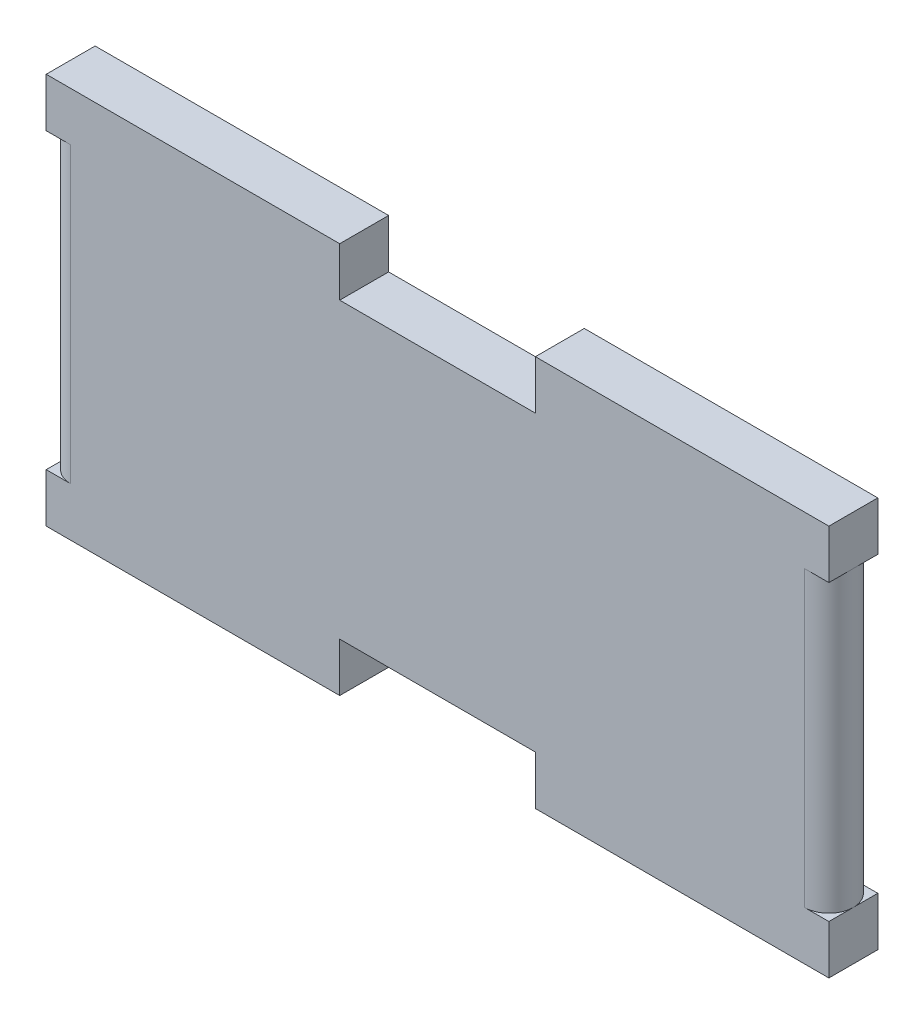
ISO-10303-21;
HEADER;
FILE_DESCRIPTION(('STEP AP214'),'2;1');
FILE_NAME('part.step','',(''),(''),'','','');
FILE_SCHEMA(('AUTOMOTIVE_DESIGN { 1 0 10303 214 1 1 1 1 }'));
ENDSEC;
DATA;
#1=APPLICATION_CONTEXT('core data for automotive mechanical design processes');
#2=APPLICATION_PROTOCOL_DEFINITION('international standard','automotive_design',2000,#1);
#3=PRODUCT_CONTEXT('',#1,'mechanical');
#4=PRODUCT('Part','Part','',(#3));
#5=PRODUCT_RELATED_PRODUCT_CATEGORY('part','',(#4));
#6=PRODUCT_DEFINITION_FORMATION('','',#4);
#7=PRODUCT_DEFINITION_CONTEXT('part definition',#1,'design');
#8=PRODUCT_DEFINITION('design','',#6,#7);
#9=PRODUCT_DEFINITION_SHAPE('','',#8);
#10=(LENGTH_UNIT() NAMED_UNIT(*) SI_UNIT(.MILLI.,.METRE.));
#11=(NAMED_UNIT(*) PLANE_ANGLE_UNIT() SI_UNIT($,.RADIAN.));
#12=(NAMED_UNIT(*) SI_UNIT($,.STERADIAN.) SOLID_ANGLE_UNIT());
#13=UNCERTAINTY_MEASURE_WITH_UNIT(LENGTH_MEASURE(1.E-05),#10,'distance_accuracy_value','');
#14=(GEOMETRIC_REPRESENTATION_CONTEXT(3) GLOBAL_UNCERTAINTY_ASSIGNED_CONTEXT((#13)) GLOBAL_UNIT_ASSIGNED_CONTEXT((#10,
#11,#12)) REPRESENTATION_CONTEXT('',''));
#15=CARTESIAN_POINT('',(0.,0.,0.));
#16=DIRECTION('',(0.,0.,1.));
#17=DIRECTION('',(1.,0.,0.));
#18=AXIS2_PLACEMENT_3D('',#15,#16,#17);
#19=CARTESIAN_POINT('',(196.84,0.,6.33999999999999));
#20=DIRECTION('',(0.,1.,0.));
#21=DIRECTION('',(0.,0.,1.));
#22=AXIS2_PLACEMENT_3D('',#19,#20,#21);
#23=PLANE('',#22);
#24=DIRECTION('',(-1.,0.,0.));
#25=VECTOR('',#24,1.);
#26=CARTESIAN_POINT('',(101.6,0.,12.7));
#27=LINE('',#26,#25);
#28=CARTESIAN_POINT('',(203.2,0.,12.7));
#29=VERTEX_POINT('',#28);
#30=CARTESIAN_POINT('',(196.85,0.,12.7));
#31=VERTEX_POINT('',#30);
#32=EDGE_CURVE('E324',#29,#31,#27,.T.);
#33=ORIENTED_EDGE('',*,*,#32,.F.);
#34=DIRECTION('',(0.,0.,1.));
#35=VECTOR('',#34,1.);
#36=CARTESIAN_POINT('',(203.2,0.,6.35));
#37=LINE('',#36,#35);
#38=CARTESIAN_POINT('',(203.2,0.,6.35));
#39=VERTEX_POINT('',#38);
#40=EDGE_CURVE('E335',#39,#29,#37,.T.);
#41=ORIENTED_EDGE('',*,*,#40,.F.);
#42=CARTESIAN_POINT('',(196.85,0.,6.35));
#43=DIRECTION('',(0.,-1.,0.));
#44=DIRECTION('',(0.,0.,-1.));
#45=AXIS2_PLACEMENT_3D('',#42,#43,#44);
#46=CIRCLE('',#45,6.35);
#47=EDGE_CURVE('E371',#31,#39,#46,.F.);
#48=ORIENTED_EDGE('',*,*,#47,.F.);
#49=EDGE_LOOP('',(#33,#41,#48));
#50=FACE_BOUND('',#49,.T.);
#51=ADVANCED_FACE('F17',(#50),#23,.T.);
#52=CARTESIAN_POINT('',(196.84,76.2,12.71));
#53=DIRECTION('',(0.,-1.,0.));
#54=DIRECTION('',(0.,0.,-1.));
#55=AXIS2_PLACEMENT_3D('',#52,#53,#54);
#56=PLANE('',#55);
#57=DIRECTION('',(0.,0.,-1.));
#58=VECTOR('',#57,1.);
#59=CARTESIAN_POINT('',(203.2,76.2,6.35));
#60=LINE('',#59,#58);
#61=CARTESIAN_POINT('',(203.2,76.2,12.7));
#62=VERTEX_POINT('',#61);
#63=CARTESIAN_POINT('',(203.2,76.2,6.35));
#64=VERTEX_POINT('',#63);
#65=EDGE_CURVE('E201',#62,#64,#60,.T.);
#66=ORIENTED_EDGE('',*,*,#65,.F.);
#67=DIRECTION('',(1.,0.,0.));
#68=VECTOR('',#67,1.);
#69=CARTESIAN_POINT('',(101.6,76.2,12.7));
#70=LINE('',#69,#68);
#71=CARTESIAN_POINT('',(196.85,76.2,12.7));
#72=VERTEX_POINT('',#71);
#73=EDGE_CURVE('E310',#72,#62,#70,.T.);
#74=ORIENTED_EDGE('',*,*,#73,.F.);
#75=CARTESIAN_POINT('',(196.85,76.2,6.35));
#76=DIRECTION('',(0.,-1.,0.));
#77=DIRECTION('',(0.,0.,-1.));
#78=AXIS2_PLACEMENT_3D('',#75,#76,#77);
#79=CIRCLE('',#78,6.35);
#80=EDGE_CURVE('E173',#64,#72,#79,.T.);
#81=ORIENTED_EDGE('',*,*,#80,.F.);
#82=EDGE_LOOP('',(#66,#74,#81));
#83=FACE_BOUND('',#82,.T.);
#84=ADVANCED_FACE('F375',(#83),#56,.T.);
#85=CARTESIAN_POINT('',(-0.00999999999999447,76.2,12.71));
#86=DIRECTION('',(0.,-1.,0.));
#87=DIRECTION('',(0.,0.,-1.));
#88=AXIS2_PLACEMENT_3D('',#85,#86,#87);
#89=PLANE('',#88);
#90=DIRECTION('',(1.,0.,0.));
#91=VECTOR('',#90,1.);
#92=CARTESIAN_POINT('',(101.6,76.2,12.7));
#93=LINE('',#92,#91);
#94=CARTESIAN_POINT('',(0.,76.2,12.7));
#95=VERTEX_POINT('',#94);
#96=CARTESIAN_POINT('',(6.35,76.2,12.7));
#97=VERTEX_POINT('',#96);
#98=EDGE_CURVE('E269',#95,#97,#93,.T.);
#99=ORIENTED_EDGE('',*,*,#98,.F.);
#100=DIRECTION('',(0.,0.,1.));
#101=VECTOR('',#100,1.);
#102=CARTESIAN_POINT('',(0.,76.2,6.35));
#103=LINE('',#102,#101);
#104=CARTESIAN_POINT('',(0.,76.2,6.35));
#105=VERTEX_POINT('',#104);
#106=EDGE_CURVE('E246',#105,#95,#103,.T.);
#107=ORIENTED_EDGE('',*,*,#106,.F.);
#108=CARTESIAN_POINT('',(6.35,76.2,6.35));
#109=DIRECTION('',(0.,1.,0.));
#110=DIRECTION('',(0.,0.,1.));
#111=AXIS2_PLACEMENT_3D('',#108,#109,#110);
#112=CIRCLE('',#111,6.35);
#113=EDGE_CURVE('E267',#97,#105,#112,.F.);
#114=ORIENTED_EDGE('',*,*,#113,.F.);
#115=EDGE_LOOP('',(#99,#107,#114));
#116=FACE_BOUND('',#115,.T.);
#117=ADVANCED_FACE('F513',(#116),#89,.T.);
#118=CARTESIAN_POINT('',(-0.00999999999999447,76.2,6.36000000000001));
#119=DIRECTION('',(0.,-1.,0.));
#120=DIRECTION('',(0.,0.,-1.));
#121=AXIS2_PLACEMENT_3D('',#118,#119,#120);
#122=PLANE('',#121);
#123=DIRECTION('',(0.,0.,1.));
#124=VECTOR('',#123,1.);
#125=CARTESIAN_POINT('',(0.,76.2,6.35));
#126=LINE('',#125,#124);
#127=CARTESIAN_POINT('',(0.,76.2,0.));
#128=VERTEX_POINT('',#127);
#129=EDGE_CURVE('E254',#128,#105,#126,.T.);
#130=ORIENTED_EDGE('',*,*,#129,.F.);
#131=DIRECTION('',(-1.,0.,0.));
#132=VECTOR('',#131,1.);
#133=CARTESIAN_POINT('',(101.6,76.2,0.));
#134=LINE('',#133,#132);
#135=CARTESIAN_POINT('',(6.35,76.2,0.));
#136=VERTEX_POINT('',#135);
#137=EDGE_CURVE('E251',#136,#128,#134,.T.);
#138=ORIENTED_EDGE('',*,*,#137,.F.);
#139=CARTESIAN_POINT('',(6.35,76.2,6.35));
#140=DIRECTION('',(0.,1.,0.));
#141=DIRECTION('',(0.,0.,1.));
#142=AXIS2_PLACEMENT_3D('',#139,#140,#141);
#143=CIRCLE('',#142,6.35);
#144=EDGE_CURVE('E364',#105,#136,#143,.F.);
#145=ORIENTED_EDGE('',*,*,#144,.F.);
#146=EDGE_LOOP('',(#130,#138,#145));
#147=FACE_BOUND('',#146,.T.);
#148=ADVANCED_FACE('F483',(#147),#122,.T.);
#149=CARTESIAN_POINT('',(0.,88.91,-0.01));
#150=DIRECTION('',(-1.,0.,0.));
#151=DIRECTION('',(0.,-1.,0.));
#152=AXIS2_PLACEMENT_3D('',#149,#150,#151);
#153=PLANE('',#152);
#154=DIRECTION('',(0.,0.,1.));
#155=VECTOR('',#154,1.);
#156=CARTESIAN_POINT('',(0.,88.9,6.35));
#157=LINE('',#156,#155);
#158=CARTESIAN_POINT('',(0.,88.9,0.));
#159=VERTEX_POINT('',#158);
#160=CARTESIAN_POINT('',(0.,88.9,12.7));
#161=VERTEX_POINT('',#160);
#162=EDGE_CURVE('E237',#159,#161,#157,.T.);
#163=ORIENTED_EDGE('',*,*,#162,.F.);
#164=DIRECTION('',(0.,1.,0.));
#165=VECTOR('',#164,1.);
#166=CARTESIAN_POINT('',(0.,38.1,0.));
#167=LINE('',#166,#165);
#168=EDGE_CURVE('E242',#128,#159,#167,.T.);
#169=ORIENTED_EDGE('',*,*,#168,.F.);
#170=ORIENTED_EDGE('',*,*,#129,.T.);
#171=ORIENTED_EDGE('',*,*,#106,.T.);
#172=DIRECTION('',(0.,-1.,0.));
#173=VECTOR('',#172,1.);
#174=CARTESIAN_POINT('',(0.,38.1,12.7));
#175=LINE('',#174,#173);
#176=EDGE_CURVE('E272',#161,#95,#175,.T.);
#177=ORIENTED_EDGE('',*,*,#176,.F.);
#178=EDGE_LOOP('',(#163,#169,#170,#171,#177));
#179=FACE_BOUND('',#178,.T.);
#180=ADVANCED_FACE('F486',(#179),#153,.T.);
#181=CARTESIAN_POINT('',(76.21,88.9,-0.01));
#182=DIRECTION('',(0.,1.,0.));
#183=DIRECTION('',(-1.,0.,0.));
#184=AXIS2_PLACEMENT_3D('',#181,#182,#183);
#185=PLANE('',#184);
#186=DIRECTION('',(-1.,0.,0.));
#187=VECTOR('',#186,1.);
#188=CARTESIAN_POINT('',(101.6,88.9,12.7));
#189=LINE('',#188,#187);
#190=CARTESIAN_POINT('',(76.2,88.9,12.7));
#191=VERTEX_POINT('',#190);
#192=EDGE_CURVE('E277',#191,#161,#189,.T.);
#193=ORIENTED_EDGE('',*,*,#192,.F.);
#194=DIRECTION('',(0.,0.,1.));
#195=VECTOR('',#194,1.);
#196=CARTESIAN_POINT('',(76.2,88.9,6.35));
#197=LINE('',#196,#195);
#198=CARTESIAN_POINT('',(76.2,88.9,0.));
#199=VERTEX_POINT('',#198);
#200=EDGE_CURVE('E228',#199,#191,#197,.T.);
#201=ORIENTED_EDGE('',*,*,#200,.F.);
#202=DIRECTION('',(1.,0.,0.));
#203=VECTOR('',#202,1.);
#204=CARTESIAN_POINT('',(101.6,88.9,0.));
#205=LINE('',#204,#203);
#206=EDGE_CURVE('E233',#159,#199,#205,.T.);
#207=ORIENTED_EDGE('',*,*,#206,.F.);
#208=ORIENTED_EDGE('',*,*,#162,.T.);
#209=EDGE_LOOP('',(#193,#201,#207,#208));
#210=FACE_BOUND('',#209,.T.);
#211=ADVANCED_FACE('F492',(#210),#185,.T.);
#212=CARTESIAN_POINT('',(76.2,76.19,-0.01));
#213=DIRECTION('',(1.,0.,0.));
#214=DIRECTION('',(0.,1.,0.));
#215=AXIS2_PLACEMENT_3D('',#212,#213,#214);
#216=PLANE('',#215);
#217=DIRECTION('',(0.,1.,0.));
#218=VECTOR('',#217,1.);
#219=CARTESIAN_POINT('',(76.2,38.1,12.7));
#220=LINE('',#219,#218);
#221=CARTESIAN_POINT('',(76.2,76.2,12.7));
#222=VERTEX_POINT('',#221);
#223=EDGE_CURVE('E285',#222,#191,#220,.T.);
#224=ORIENTED_EDGE('',*,*,#223,.F.);
#225=DIRECTION('',(0.,0.,1.));
#226=VECTOR('',#225,1.);
#227=CARTESIAN_POINT('',(76.2,76.2,6.35));
#228=LINE('',#227,#226);
#229=CARTESIAN_POINT('',(76.2,76.2,0.));
#230=VERTEX_POINT('',#229);
#231=EDGE_CURVE('E219',#230,#222,#228,.T.);
#232=ORIENTED_EDGE('',*,*,#231,.F.);
#233=DIRECTION('',(0.,-1.,0.));
#234=VECTOR('',#233,1.);
#235=CARTESIAN_POINT('',(76.2,38.1,0.));
#236=LINE('',#235,#234);
#237=EDGE_CURVE('E224',#199,#230,#236,.T.);
#238=ORIENTED_EDGE('',*,*,#237,.F.);
#239=ORIENTED_EDGE('',*,*,#200,.T.);
#240=EDGE_LOOP('',(#224,#232,#238,#239));
#241=FACE_BOUND('',#240,.T.);
#242=ADVANCED_FACE('F495',(#241),#216,.T.);
#243=CARTESIAN_POINT('',(127.01,76.2,-0.01));
#244=DIRECTION('',(0.,1.,0.));
#245=DIRECTION('',(-1.,0.,0.));
#246=AXIS2_PLACEMENT_3D('',#243,#244,#245);
#247=PLANE('',#246);
#248=ORIENTED_EDGE('',*,*,#231,.T.);
#249=DIRECTION('',(-1.,0.,0.));
#250=VECTOR('',#249,1.);
#251=CARTESIAN_POINT('',(101.6,76.2,12.7));
#252=LINE('',#251,#250);
#253=CARTESIAN_POINT('',(127.,76.2,12.7));
#254=VERTEX_POINT('',#253);
#255=EDGE_CURVE('E290',#254,#222,#252,.T.);
#256=ORIENTED_EDGE('',*,*,#255,.F.);
#257=DIRECTION('',(0.,0.,1.));
#258=VECTOR('',#257,1.);
#259=CARTESIAN_POINT('',(127.,76.2,6.35));
#260=LINE('',#259,#258);
#261=CARTESIAN_POINT('',(127.,76.2,0.));
#262=VERTEX_POINT('',#261);
#263=EDGE_CURVE('E210',#262,#254,#260,.T.);
#264=ORIENTED_EDGE('',*,*,#263,.F.);
#265=DIRECTION('',(1.,0.,0.));
#266=VECTOR('',#265,1.);
#267=CARTESIAN_POINT('',(101.6,76.2,0.));
#268=LINE('',#267,#266);
#269=EDGE_CURVE('E215',#230,#262,#268,.T.);
#270=ORIENTED_EDGE('',*,*,#269,.F.);
#271=EDGE_LOOP('',(#248,#256,#264,#270));
#272=FACE_BOUND('',#271,.T.);
#273=ADVANCED_FACE('F499',(#272),#247,.T.);
#274=CARTESIAN_POINT('',(127.,88.91,-0.01));
#275=DIRECTION('',(-1.,0.,0.));
#276=DIRECTION('',(0.,-1.,0.));
#277=AXIS2_PLACEMENT_3D('',#274,#275,#276);
#278=PLANE('',#277);
#279=DIRECTION('',(0.,-1.,0.));
#280=VECTOR('',#279,1.);
#281=CARTESIAN_POINT('',(127.,38.1,12.7));
#282=LINE('',#281,#280);
#283=CARTESIAN_POINT('',(127.,88.9,12.7));
#284=VERTEX_POINT('',#283);
#285=EDGE_CURVE('E295',#284,#254,#282,.T.);
#286=ORIENTED_EDGE('',*,*,#285,.F.);
#287=DIRECTION('',(0.,0.,1.));
#288=VECTOR('',#287,1.);
#289=CARTESIAN_POINT('',(127.,88.9,6.35));
#290=LINE('',#289,#288);
#291=CARTESIAN_POINT('',(127.,88.9,0.));
#292=VERTEX_POINT('',#291);
#293=EDGE_CURVE('E208',#292,#284,#290,.T.);
#294=ORIENTED_EDGE('',*,*,#293,.F.);
#295=DIRECTION('',(0.,1.,0.));
#296=VECTOR('',#295,1.);
#297=CARTESIAN_POINT('',(127.,38.1,0.));
#298=LINE('',#297,#296);
#299=EDGE_CURVE('E205',#262,#292,#298,.T.);
#300=ORIENTED_EDGE('',*,*,#299,.F.);
#301=ORIENTED_EDGE('',*,*,#263,.T.);
#302=EDGE_LOOP('',(#286,#294,#300,#301));
#303=FACE_BOUND('',#302,.T.);
#304=ADVANCED_FACE('F504',(#303),#278,.T.);
#305=CARTESIAN_POINT('',(203.21,88.9,-0.01));
#306=DIRECTION('',(0.,1.,0.));
#307=DIRECTION('',(-1.,0.,0.));
#308=AXIS2_PLACEMENT_3D('',#305,#306,#307);
#309=PLANE('',#308);
#310=DIRECTION('',(-1.,0.,0.));
#311=VECTOR('',#310,1.);
#312=CARTESIAN_POINT('',(101.6,88.9,12.7));
#313=LINE('',#312,#311);
#314=CARTESIAN_POINT('',(203.2,88.9,12.7));
#315=VERTEX_POINT('',#314);
#316=EDGE_CURVE('E300',#315,#284,#313,.T.);
#317=ORIENTED_EDGE('',*,*,#316,.F.);
#318=DIRECTION('',(0.,0.,1.));
#319=VECTOR('',#318,1.);
#320=CARTESIAN_POINT('',(203.2,88.9,6.35));
#321=LINE('',#320,#319);
#322=CARTESIAN_POINT('',(203.2,88.9,0.));
#323=VERTEX_POINT('',#322);
#324=EDGE_CURVE('E195',#323,#315,#321,.T.);
#325=ORIENTED_EDGE('',*,*,#324,.F.);
#326=DIRECTION('',(1.,0.,0.));
#327=VECTOR('',#326,1.);
#328=CARTESIAN_POINT('',(101.6,88.9,0.));
#329=LINE('',#328,#327);
#330=EDGE_CURVE('E188',#292,#323,#329,.T.);
#331=ORIENTED_EDGE('',*,*,#330,.F.);
#332=ORIENTED_EDGE('',*,*,#293,.T.);
#333=EDGE_LOOP('',(#317,#325,#331,#332));
#334=FACE_BOUND('',#333,.T.);
#335=ADVANCED_FACE('F507',(#334),#309,.T.);
#336=CARTESIAN_POINT('',(203.2,76.19,-0.01));
#337=DIRECTION('',(1.,0.,0.));
#338=DIRECTION('',(0.,1.,0.));
#339=AXIS2_PLACEMENT_3D('',#336,#337,#338);
#340=PLANE('',#339);
#341=ORIENTED_EDGE('',*,*,#324,.T.);
#342=DIRECTION('',(0.,1.,0.));
#343=VECTOR('',#342,1.);
#344=CARTESIAN_POINT('',(203.2,38.1,12.7));
#345=LINE('',#344,#343);
#346=EDGE_CURVE('E305',#62,#315,#345,.T.);
#347=ORIENTED_EDGE('',*,*,#346,.F.);
#348=ORIENTED_EDGE('',*,*,#65,.T.);
#349=DIRECTION('',(0.,0.,1.));
#350=VECTOR('',#349,1.);
#351=CARTESIAN_POINT('',(203.2,76.2,3.17500000000001));
#352=LINE('',#351,#350);
#353=CARTESIAN_POINT('',(203.2,76.2,0.));
#354=VERTEX_POINT('',#353);
#355=EDGE_CURVE('E170',#354,#64,#352,.T.);
#356=ORIENTED_EDGE('',*,*,#355,.F.);
#357=DIRECTION('',(0.,-1.,0.));
#358=VECTOR('',#357,1.);
#359=CARTESIAN_POINT('',(203.2,38.1,0.));
#360=LINE('',#359,#358);
#361=EDGE_CURVE('E186',#323,#354,#360,.T.);
#362=ORIENTED_EDGE('',*,*,#361,.F.);
#363=EDGE_LOOP('',(#341,#347,#348,#356,#362));
#364=FACE_BOUND('',#363,.T.);
#365=ADVANCED_FACE('F509',(#364),#340,.T.);
#366=CARTESIAN_POINT('',(196.84,76.2,6.36000000000001));
#367=DIRECTION('',(0.,-1.,0.));
#368=DIRECTION('',(0.,0.,-1.));
#369=AXIS2_PLACEMENT_3D('',#366,#367,#368);
#370=PLANE('',#369);
#371=DIRECTION('',(-1.,0.,0.));
#372=VECTOR('',#371,1.);
#373=CARTESIAN_POINT('',(101.6,76.2,0.));
#374=LINE('',#373,#372);
#375=CARTESIAN_POINT('',(196.85,76.2,0.));
#376=VERTEX_POINT('',#375);
#377=EDGE_CURVE('E168',#354,#376,#374,.T.);
#378=ORIENTED_EDGE('',*,*,#377,.F.);
#379=ORIENTED_EDGE('',*,*,#355,.T.);
#380=CARTESIAN_POINT('',(196.85,76.2,6.35));
#381=DIRECTION('',(0.,-1.,0.));
#382=DIRECTION('',(0.,0.,-1.));
#383=AXIS2_PLACEMENT_3D('',#380,#381,#382);
#384=CIRCLE('',#383,6.35);
#385=EDGE_CURVE('E21',#376,#64,#384,.T.);
#386=ORIENTED_EDGE('',*,*,#385,.F.);
#387=EDGE_LOOP('',(#378,#379,#386));
#388=FACE_BOUND('',#387,.T.);
#389=ADVANCED_FACE('F166',(#388),#370,.T.);
#390=CARTESIAN_POINT('',(196.85,76.2,6.35));
#391=DIRECTION('',(0.,-1.,0.));
#392=DIRECTION('',(0.,0.,-1.));
#393=AXIS2_PLACEMENT_3D('',#390,#391,#392);
#394=CYLINDRICAL_SURFACE('',#393,6.35);
#395=CARTESIAN_POINT('',(196.85,0.,6.35));
#396=DIRECTION('',(0.,-1.,0.));
#397=DIRECTION('',(0.,0.,-1.));
#398=AXIS2_PLACEMENT_3D('',#395,#396,#397);
#399=CIRCLE('',#398,6.35);
#400=CARTESIAN_POINT('',(196.85,0.,0.));
#401=VERTEX_POINT('',#400);
#402=EDGE_CURVE('E178',#401,#39,#399,.T.);
#403=ORIENTED_EDGE('',*,*,#402,.F.);
#404=DIRECTION('',(0.,-1.,0.));
#405=VECTOR('',#404,1.);
#406=CARTESIAN_POINT('',(196.85,38.1,0.));
#407=LINE('',#406,#405);
#408=EDGE_CURVE('E175',#376,#401,#407,.T.);
#409=ORIENTED_EDGE('',*,*,#408,.F.);
#410=ORIENTED_EDGE('',*,*,#385,.T.);
#411=ORIENTED_EDGE('',*,*,#80,.T.);
#412=DIRECTION('',(0.,1.,0.));
#413=VECTOR('',#412,1.);
#414=CARTESIAN_POINT('',(196.85,38.1,12.7));
#415=LINE('',#414,#413);
#416=EDGE_CURVE('E319',#31,#72,#415,.T.);
#417=ORIENTED_EDGE('',*,*,#416,.F.);
#418=ORIENTED_EDGE('',*,*,#47,.T.);
#419=EDGE_LOOP('',(#403,#409,#410,#411,#417,#418));
#420=FACE_BOUND('',#419,.T.);
#421=ADVANCED_FACE('F176',(#420),#394,.T.);
#422=CARTESIAN_POINT('',(196.84,0.,-0.0100000000000011));
#423=DIRECTION('',(0.,1.,0.));
#424=DIRECTION('',(0.,0.,1.));
#425=AXIS2_PLACEMENT_3D('',#422,#423,#424);
#426=PLANE('',#425);
#427=DIRECTION('',(0.,0.,1.));
#428=VECTOR('',#427,1.);
#429=CARTESIAN_POINT('',(203.2,0.,6.35));
#430=LINE('',#429,#428);
#431=CARTESIAN_POINT('',(203.2,0.,0.));
#432=VERTEX_POINT('',#431);
#433=EDGE_CURVE('E337',#432,#39,#430,.T.);
#434=ORIENTED_EDGE('',*,*,#433,.F.);
#435=DIRECTION('',(1.,0.,0.));
#436=VECTOR('',#435,1.);
#437=CARTESIAN_POINT('',(101.6,0.,0.));
#438=LINE('',#437,#436);
#439=EDGE_CURVE('E181',#401,#432,#438,.T.);
#440=ORIENTED_EDGE('',*,*,#439,.F.);
#441=ORIENTED_EDGE('',*,*,#402,.T.);
#442=EDGE_LOOP('',(#434,#440,#441));
#443=FACE_BOUND('',#442,.T.);
#444=ADVANCED_FACE('F386',(#443),#426,.T.);
#445=CARTESIAN_POINT('',(203.2,-12.71,-0.01));
#446=DIRECTION('',(1.,0.,0.));
#447=DIRECTION('',(0.,1.,0.));
#448=AXIS2_PLACEMENT_3D('',#445,#446,#447);
#449=PLANE('',#448);
#450=DIRECTION('',(0.,-1.,0.));
#451=VECTOR('',#450,1.);
#452=CARTESIAN_POINT('',(203.2,38.1,0.));
#453=LINE('',#452,#451);
#454=CARTESIAN_POINT('',(203.2,-12.7,0.));
#455=VERTEX_POINT('',#454);
#456=EDGE_CURVE('E390',#432,#455,#453,.T.);
#457=ORIENTED_EDGE('',*,*,#456,.F.);
#458=ORIENTED_EDGE('',*,*,#433,.T.);
#459=ORIENTED_EDGE('',*,*,#40,.T.);
#460=DIRECTION('',(0.,1.,0.));
#461=VECTOR('',#460,1.);
#462=CARTESIAN_POINT('',(203.2,38.1,12.7));
#463=LINE('',#462,#461);
#464=CARTESIAN_POINT('',(203.2,-12.7,12.7));
#465=VERTEX_POINT('',#464);
#466=EDGE_CURVE('E327',#465,#29,#463,.T.);
#467=ORIENTED_EDGE('',*,*,#466,.F.);
#468=DIRECTION('',(0.,0.,1.));
#469=VECTOR('',#468,1.);
#470=CARTESIAN_POINT('',(203.2,-12.7,6.35));
#471=LINE('',#470,#469);
#472=EDGE_CURVE('E391',#455,#465,#471,.T.);
#473=ORIENTED_EDGE('',*,*,#472,.F.);
#474=EDGE_LOOP('',(#457,#458,#459,#467,#473));
#475=FACE_BOUND('',#474,.T.);
#476=ADVANCED_FACE('F388',(#475),#449,.T.);
#477=CARTESIAN_POINT('',(126.99,-12.7,-0.01));
#478=DIRECTION('',(0.,-1.,0.));
#479=DIRECTION('',(1.,0.,0.));
#480=AXIS2_PLACEMENT_3D('',#477,#478,#479);
#481=PLANE('',#480);
#482=DIRECTION('',(1.,0.,0.));
#483=VECTOR('',#482,1.);
#484=CARTESIAN_POINT('',(101.6,-12.7,12.7));
#485=LINE('',#484,#483);
#486=CARTESIAN_POINT('',(127.,-12.7,12.7));
#487=VERTEX_POINT('',#486);
#488=EDGE_CURVE('E332',#487,#465,#485,.T.);
#489=ORIENTED_EDGE('',*,*,#488,.F.);
#490=DIRECTION('',(0.,0.,1.));
#491=VECTOR('',#490,1.);
#492=CARTESIAN_POINT('',(127.,-12.7,6.35));
#493=LINE('',#492,#491);
#494=CARTESIAN_POINT('',(127.,-12.7,0.));
#495=VERTEX_POINT('',#494);
#496=EDGE_CURVE('E393',#495,#487,#493,.T.);
#497=ORIENTED_EDGE('',*,*,#496,.F.);
#498=DIRECTION('',(-1.,0.,0.));
#499=VECTOR('',#498,1.);
#500=CARTESIAN_POINT('',(101.6,-12.7,0.));
#501=LINE('',#500,#499);
#502=EDGE_CURVE('E402',#455,#495,#501,.T.);
#503=ORIENTED_EDGE('',*,*,#502,.F.);
#504=ORIENTED_EDGE('',*,*,#472,.T.);
#505=EDGE_LOOP('',(#489,#497,#503,#504));
#506=FACE_BOUND('',#505,.T.);
#507=ADVANCED_FACE('F538',(#506),#481,.T.);
#508=CARTESIAN_POINT('',(127.,0.01,-0.01));
#509=DIRECTION('',(-1.,0.,0.));
#510=DIRECTION('',(0.,-1.,0.));
#511=AXIS2_PLACEMENT_3D('',#508,#509,#510);
#512=PLANE('',#511);
#513=DIRECTION('',(0.,-1.,0.));
#514=VECTOR('',#513,1.);
#515=CARTESIAN_POINT('',(127.,38.1,12.7));
#516=LINE('',#515,#514);
#517=CARTESIAN_POINT('',(127.,0.,12.7));
#518=VERTEX_POINT('',#517);
#519=EDGE_CURVE('E342',#518,#487,#516,.T.);
#520=ORIENTED_EDGE('',*,*,#519,.F.);
#521=DIRECTION('',(0.,0.,1.));
#522=VECTOR('',#521,1.);
#523=CARTESIAN_POINT('',(127.,0.,6.35));
#524=LINE('',#523,#522);
#525=CARTESIAN_POINT('',(127.,0.,0.));
#526=VERTEX_POINT('',#525);
#527=EDGE_CURVE('E414',#526,#518,#524,.T.);
#528=ORIENTED_EDGE('',*,*,#527,.F.);
#529=DIRECTION('',(0.,1.,0.));
#530=VECTOR('',#529,1.);
#531=CARTESIAN_POINT('',(127.,38.1,0.));
#532=LINE('',#531,#530);
#533=EDGE_CURVE('E404',#495,#526,#532,.T.);
#534=ORIENTED_EDGE('',*,*,#533,.F.);
#535=ORIENTED_EDGE('',*,*,#496,.T.);
#536=EDGE_LOOP('',(#520,#528,#534,#535));
#537=FACE_BOUND('',#536,.T.);
#538=ADVANCED_FACE('F535',(#537),#512,.T.);
#539=CARTESIAN_POINT('',(76.19,0.,-0.01));
#540=DIRECTION('',(0.,-1.,0.));
#541=DIRECTION('',(1.,0.,0.));
#542=AXIS2_PLACEMENT_3D('',#539,#540,#541);
#543=PLANE('',#542);
#544=ORIENTED_EDGE('',*,*,#527,.T.);
#545=DIRECTION('',(1.,0.,0.));
#546=VECTOR('',#545,1.);
#547=CARTESIAN_POINT('',(101.6,0.,12.7));
#548=LINE('',#547,#546);
#549=CARTESIAN_POINT('',(76.2,0.,12.7));
#550=VERTEX_POINT('',#549);
#551=EDGE_CURVE('E347',#550,#518,#548,.T.);
#552=ORIENTED_EDGE('',*,*,#551,.F.);
#553=DIRECTION('',(0.,0.,1.));
#554=VECTOR('',#553,1.);
#555=CARTESIAN_POINT('',(76.2,0.,6.35));
#556=LINE('',#555,#554);
#557=CARTESIAN_POINT('',(76.2,0.,0.));
#558=VERTEX_POINT('',#557);
#559=EDGE_CURVE('E423',#558,#550,#556,.T.);
#560=ORIENTED_EDGE('',*,*,#559,.F.);
#561=DIRECTION('',(-1.,0.,0.));
#562=VECTOR('',#561,1.);
#563=CARTESIAN_POINT('',(101.6,0.,0.));
#564=LINE('',#563,#562);
#565=EDGE_CURVE('E419',#526,#558,#564,.T.);
#566=ORIENTED_EDGE('',*,*,#565,.F.);
#567=EDGE_LOOP('',(#544,#552,#560,#566));
#568=FACE_BOUND('',#567,.T.);
#569=ADVANCED_FACE('F531',(#568),#543,.T.);
#570=CARTESIAN_POINT('',(76.2,-12.71,-0.01));
#571=DIRECTION('',(1.,0.,0.));
#572=DIRECTION('',(0.,1.,0.));
#573=AXIS2_PLACEMENT_3D('',#570,#571,#572);
#574=PLANE('',#573);
#575=DIRECTION('',(0.,1.,0.));
#576=VECTOR('',#575,1.);
#577=CARTESIAN_POINT('',(76.2,38.1,12.7));
#578=LINE('',#577,#576);
#579=CARTESIAN_POINT('',(76.2,-12.7,12.7));
#580=VERTEX_POINT('',#579);
#581=EDGE_CURVE('E352',#580,#550,#578,.T.);
#582=ORIENTED_EDGE('',*,*,#581,.F.);
#583=DIRECTION('',(0.,0.,1.));
#584=VECTOR('',#583,1.);
#585=CARTESIAN_POINT('',(76.2,-12.7,6.35));
#586=LINE('',#585,#584);
#587=CARTESIAN_POINT('',(76.2,-12.7,0.));
#588=VERTEX_POINT('',#587);
#589=EDGE_CURVE('E432',#588,#580,#586,.T.);
#590=ORIENTED_EDGE('',*,*,#589,.F.);
#591=DIRECTION('',(0.,-1.,0.));
#592=VECTOR('',#591,1.);
#593=CARTESIAN_POINT('',(76.2,38.1,0.));
#594=LINE('',#593,#592);
#595=EDGE_CURVE('E428',#558,#588,#594,.T.);
#596=ORIENTED_EDGE('',*,*,#595,.F.);
#597=ORIENTED_EDGE('',*,*,#559,.T.);
#598=EDGE_LOOP('',(#582,#590,#596,#597));
#599=FACE_BOUND('',#598,.T.);
#600=ADVANCED_FACE('F527',(#599),#574,.T.);
#601=CARTESIAN_POINT('',(-0.01,-12.7,-0.01));
#602=DIRECTION('',(0.,-1.,0.));
#603=DIRECTION('',(1.,0.,0.));
#604=AXIS2_PLACEMENT_3D('',#601,#602,#603);
#605=PLANE('',#604);
#606=DIRECTION('',(1.,0.,0.));
#607=VECTOR('',#606,1.);
#608=CARTESIAN_POINT('',(101.6,-12.7,12.7));
#609=LINE('',#608,#607);
#610=CARTESIAN_POINT('',(0.,-12.7,12.7));
#611=VERTEX_POINT('',#610);
#612=EDGE_CURVE('E357',#611,#580,#609,.T.);
#613=ORIENTED_EDGE('',*,*,#612,.F.);
#614=DIRECTION('',(0.,0.,1.));
#615=VECTOR('',#614,1.);
#616=CARTESIAN_POINT('',(0.,-12.7,6.35));
#617=LINE('',#616,#615);
#618=CARTESIAN_POINT('',(0.,-12.7,0.));
#619=VERTEX_POINT('',#618);
#620=EDGE_CURVE('E446',#619,#611,#617,.T.);
#621=ORIENTED_EDGE('',*,*,#620,.F.);
#622=DIRECTION('',(-1.,0.,0.));
#623=VECTOR('',#622,1.);
#624=CARTESIAN_POINT('',(101.6,-12.7,0.));
#625=LINE('',#624,#623);
#626=EDGE_CURVE('E437',#588,#619,#625,.T.);
#627=ORIENTED_EDGE('',*,*,#626,.F.);
#628=ORIENTED_EDGE('',*,*,#589,.T.);
#629=EDGE_LOOP('',(#613,#621,#627,#628));
#630=FACE_BOUND('',#629,.T.);
#631=ADVANCED_FACE('F523',(#630),#605,.T.);
#632=CARTESIAN_POINT('',(-0.00999999999999447,-12.71,12.7));
#633=DIRECTION('',(0.,0.,1.));
#634=DIRECTION('',(1.,0.,0.));
#635=AXIS2_PLACEMENT_3D('',#632,#633,#634);
#636=PLANE('',#635);
#637=ORIENTED_EDGE('',*,*,#176,.T.);
#638=ORIENTED_EDGE('',*,*,#98,.T.);
#639=DIRECTION('',(0.,1.,0.));
#640=VECTOR('',#639,1.);
#641=CARTESIAN_POINT('',(6.35,38.1,12.7));
#642=LINE('',#641,#640);
#643=CARTESIAN_POINT('',(6.35,0.,12.7));
#644=VERTEX_POINT('',#643);
#645=EDGE_CURVE('E264',#644,#97,#642,.T.);
#646=ORIENTED_EDGE('',*,*,#645,.F.);
#647=DIRECTION('',(1.,0.,0.));
#648=VECTOR('',#647,1.);
#649=CARTESIAN_POINT('',(3.175,0.,12.7));
#650=LINE('',#649,#648);
#651=CARTESIAN_POINT('',(0.,0.,12.7));
#652=VERTEX_POINT('',#651);
#653=EDGE_CURVE('E271',#652,#644,#650,.T.);
#654=ORIENTED_EDGE('',*,*,#653,.F.);
#655=DIRECTION('',(0.,1.,0.));
#656=VECTOR('',#655,1.);
#657=CARTESIAN_POINT('',(0.,-6.34999999999999,12.7));
#658=LINE('',#657,#656);
#659=EDGE_CURVE('E449',#611,#652,#658,.T.);
#660=ORIENTED_EDGE('',*,*,#659,.F.);
#661=ORIENTED_EDGE('',*,*,#612,.T.);
#662=ORIENTED_EDGE('',*,*,#581,.T.);
#663=ORIENTED_EDGE('',*,*,#551,.T.);
#664=ORIENTED_EDGE('',*,*,#519,.T.);
#665=ORIENTED_EDGE('',*,*,#488,.T.);
#666=ORIENTED_EDGE('',*,*,#466,.T.);
#667=ORIENTED_EDGE('',*,*,#32,.T.);
#668=ORIENTED_EDGE('',*,*,#416,.T.);
#669=ORIENTED_EDGE('',*,*,#73,.T.);
#670=ORIENTED_EDGE('',*,*,#346,.T.);
#671=ORIENTED_EDGE('',*,*,#316,.T.);
#672=ORIENTED_EDGE('',*,*,#285,.T.);
#673=ORIENTED_EDGE('',*,*,#255,.T.);
#674=ORIENTED_EDGE('',*,*,#223,.T.);
#675=ORIENTED_EDGE('',*,*,#192,.T.);
#676=EDGE_LOOP('',(#637,#638,#646,#654,#660,#661,#662,#663,#664,#665,#666,#667,#668,#669,#670,
#671,#672,#673,#674,#675));
#677=FACE_BOUND('',#676,.T.);
#678=ADVANCED_FACE('F378',(#677),#636,.T.);
#679=CARTESIAN_POINT('',(-0.00999999999999447,0.,6.33999999999999));
#680=DIRECTION('',(0.,1.,0.));
#681=DIRECTION('',(0.,0.,1.));
#682=AXIS2_PLACEMENT_3D('',#679,#680,#681);
#683=PLANE('',#682);
#684=DIRECTION('',(0.,0.,-1.));
#685=VECTOR('',#684,1.);
#686=CARTESIAN_POINT('',(0.,0.,6.35));
#687=LINE('',#686,#685);
#688=CARTESIAN_POINT('',(0.,0.,6.35));
#689=VERTEX_POINT('',#688);
#690=EDGE_CURVE('E363',#652,#689,#687,.T.);
#691=ORIENTED_EDGE('',*,*,#690,.F.);
#692=ORIENTED_EDGE('',*,*,#653,.T.);
#693=CARTESIAN_POINT('',(6.35,0.,6.35));
#694=DIRECTION('',(0.,1.,0.));
#695=DIRECTION('',(0.,0.,1.));
#696=AXIS2_PLACEMENT_3D('',#693,#694,#695);
#697=CIRCLE('',#696,6.35);
#698=EDGE_CURVE('E268',#689,#644,#697,.T.);
#699=ORIENTED_EDGE('',*,*,#698,.F.);
#700=EDGE_LOOP('',(#691,#692,#699));
#701=FACE_BOUND('',#700,.T.);
#702=ADVANCED_FACE('F517',(#701),#683,.T.);
#703=CARTESIAN_POINT('',(6.35,0.,6.35));
#704=DIRECTION('',(0.,1.,0.));
#705=DIRECTION('',(0.,0.,1.));
#706=AXIS2_PLACEMENT_3D('',#703,#704,#705);
#707=CYLINDRICAL_SURFACE('',#706,6.35);
#708=ORIENTED_EDGE('',*,*,#144,.T.);
#709=DIRECTION('',(0.,1.,0.));
#710=VECTOR('',#709,1.);
#711=CARTESIAN_POINT('',(6.35,38.1,0.));
#712=LINE('',#711,#710);
#713=CARTESIAN_POINT('',(6.35,0.,0.));
#714=VERTEX_POINT('',#713);
#715=EDGE_CURVE('E261',#714,#136,#712,.T.);
#716=ORIENTED_EDGE('',*,*,#715,.F.);
#717=CARTESIAN_POINT('',(6.35,0.,6.35));
#718=DIRECTION('',(0.,1.,0.));
#719=DIRECTION('',(0.,0.,1.));
#720=AXIS2_PLACEMENT_3D('',#717,#718,#719);
#721=CIRCLE('',#720,6.35);
#722=EDGE_CURVE('E360',#689,#714,#721,.F.);
#723=ORIENTED_EDGE('',*,*,#722,.F.);
#724=ORIENTED_EDGE('',*,*,#698,.T.);
#725=ORIENTED_EDGE('',*,*,#645,.T.);
#726=ORIENTED_EDGE('',*,*,#113,.T.);
#727=EDGE_LOOP('',(#708,#716,#723,#724,#725,#726));
#728=FACE_BOUND('',#727,.T.);
#729=ADVANCED_FACE('F479',(#728),#707,.T.);
#730=CARTESIAN_POINT('',(203.21,-12.71,0.));
#731=DIRECTION('',(0.,0.,-1.));
#732=DIRECTION('',(-1.,0.,0.));
#733=AXIS2_PLACEMENT_3D('',#730,#731,#732);
#734=PLANE('',#733);
#735=DIRECTION('',(0.,-1.,0.));
#736=VECTOR('',#735,1.);
#737=CARTESIAN_POINT('',(0.,-6.34999999999999,0.));
#738=LINE('',#737,#736);
#739=CARTESIAN_POINT('',(0.,0.,0.));
#740=VERTEX_POINT('',#739);
#741=EDGE_CURVE('E36',#740,#619,#738,.T.);
#742=ORIENTED_EDGE('',*,*,#741,.F.);
#743=DIRECTION('',(-1.,0.,0.));
#744=VECTOR('',#743,1.);
#745=CARTESIAN_POINT('',(3.175,0.,0.));
#746=LINE('',#745,#744);
#747=EDGE_CURVE('E27',#714,#740,#746,.T.);
#748=ORIENTED_EDGE('',*,*,#747,.F.);
#749=ORIENTED_EDGE('',*,*,#715,.T.);
#750=ORIENTED_EDGE('',*,*,#137,.T.);
#751=ORIENTED_EDGE('',*,*,#168,.T.);
#752=ORIENTED_EDGE('',*,*,#206,.T.);
#753=ORIENTED_EDGE('',*,*,#237,.T.);
#754=ORIENTED_EDGE('',*,*,#269,.T.);
#755=ORIENTED_EDGE('',*,*,#299,.T.);
#756=ORIENTED_EDGE('',*,*,#330,.T.);
#757=ORIENTED_EDGE('',*,*,#361,.T.);
#758=ORIENTED_EDGE('',*,*,#377,.T.);
#759=ORIENTED_EDGE('',*,*,#408,.T.);
#760=ORIENTED_EDGE('',*,*,#439,.T.);
#761=ORIENTED_EDGE('',*,*,#456,.T.);
#762=ORIENTED_EDGE('',*,*,#502,.T.);
#763=ORIENTED_EDGE('',*,*,#533,.T.);
#764=ORIENTED_EDGE('',*,*,#565,.T.);
#765=ORIENTED_EDGE('',*,*,#595,.T.);
#766=ORIENTED_EDGE('',*,*,#626,.T.);
#767=EDGE_LOOP('',(#742,#748,#749,#750,#751,#752,#753,#754,#755,#756,#757,#758,#759,#760,#761,
#762,#763,#764,#765,#766));
#768=FACE_BOUND('',#767,.T.);
#769=ADVANCED_FACE('F183',(#768),#734,.T.);
#770=CARTESIAN_POINT('',(0.,0.0100000000000033,-0.01));
#771=DIRECTION('',(-1.,0.,0.));
#772=DIRECTION('',(0.,-1.,0.));
#773=AXIS2_PLACEMENT_3D('',#770,#771,#772);
#774=PLANE('',#773);
#775=ORIENTED_EDGE('',*,*,#659,.T.);
#776=ORIENTED_EDGE('',*,*,#690,.T.);
#777=DIRECTION('',(0.,0.,1.));
#778=VECTOR('',#777,1.);
#779=CARTESIAN_POINT('',(0.,0.,3.17500000000001));
#780=LINE('',#779,#778);
#781=EDGE_CURVE('E11',#740,#689,#780,.T.);
#782=ORIENTED_EDGE('',*,*,#781,.F.);
#783=ORIENTED_EDGE('',*,*,#741,.T.);
#784=ORIENTED_EDGE('',*,*,#620,.T.);
#785=EDGE_LOOP('',(#775,#776,#782,#783,#784));
#786=FACE_BOUND('',#785,.T.);
#787=ADVANCED_FACE('F519',(#786),#774,.T.);
#788=CARTESIAN_POINT('',(-0.00999999999999447,0.,-0.01));
#789=DIRECTION('',(0.,1.,0.));
#790=DIRECTION('',(0.,0.,1.));
#791=AXIS2_PLACEMENT_3D('',#788,#789,#790);
#792=PLANE('',#791);
#793=ORIENTED_EDGE('',*,*,#747,.T.);
#794=ORIENTED_EDGE('',*,*,#781,.T.);
#795=ORIENTED_EDGE('',*,*,#722,.T.);
#796=EDGE_LOOP('',(#793,#794,#795));
#797=FACE_BOUND('',#796,.T.);
#798=ADVANCED_FACE('F19',(#797),#792,.T.);
#799=CLOSED_SHELL('',(#51,#84,#117,#148,#180,#211,#242,#273,#304,#335,#365,#389,#421,#444,#476,
#507,#538,#569,#600,#631,#678,#702,#729,#769,#787,#798));
#800=MANIFOLD_SOLID_BREP('B1',#799);
#801=ADVANCED_BREP_SHAPE_REPRESENTATION('',(#18,#800),#14);
#802=SHAPE_DEFINITION_REPRESENTATION(#9,#801);
ENDSEC;
END-ISO-10303-21;
